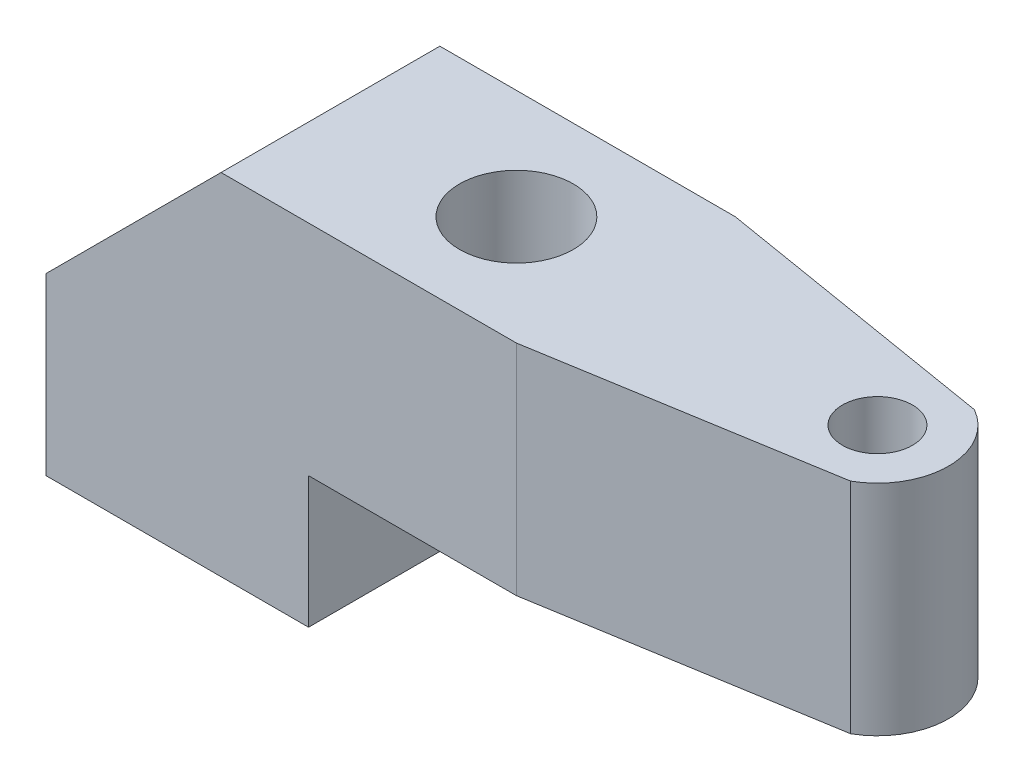
ISO-10303-21;
HEADER;
FILE_DESCRIPTION(('STEP AP214'),'2;1');
FILE_NAME('part.step','',(''),(''),'','','');
FILE_SCHEMA(('AUTOMOTIVE_DESIGN { 1 0 10303 214 1 1 1 1 }'));
ENDSEC;
DATA;
#1=APPLICATION_CONTEXT('core data for automotive mechanical design processes');
#2=APPLICATION_PROTOCOL_DEFINITION('international standard','automotive_design',2000,#1);
#3=PRODUCT_CONTEXT('',#1,'mechanical');
#4=PRODUCT('Part','Part','',(#3));
#5=PRODUCT_RELATED_PRODUCT_CATEGORY('part','',(#4));
#6=PRODUCT_DEFINITION_FORMATION('','',#4);
#7=PRODUCT_DEFINITION_CONTEXT('part definition',#1,'design');
#8=PRODUCT_DEFINITION('design','',#6,#7);
#9=PRODUCT_DEFINITION_SHAPE('','',#8);
#10=(LENGTH_UNIT() NAMED_UNIT(*) SI_UNIT(.MILLI.,.METRE.));
#11=(NAMED_UNIT(*) PLANE_ANGLE_UNIT() SI_UNIT($,.RADIAN.));
#12=(NAMED_UNIT(*) SI_UNIT($,.STERADIAN.) SOLID_ANGLE_UNIT());
#13=UNCERTAINTY_MEASURE_WITH_UNIT(LENGTH_MEASURE(1.E-05),#10,'distance_accuracy_value','');
#14=(GEOMETRIC_REPRESENTATION_CONTEXT(3) GLOBAL_UNCERTAINTY_ASSIGNED_CONTEXT((#13)) GLOBAL_UNIT_ASSIGNED_CONTEXT((#10,
#11,#12)) REPRESENTATION_CONTEXT('',''));
#15=CARTESIAN_POINT('',(0.,0.,0.));
#16=DIRECTION('',(0.,0.,1.));
#17=DIRECTION('',(1.,0.,0.));
#18=AXIS2_PLACEMENT_3D('',#15,#16,#17);
#19=CARTESIAN_POINT('',(231.,16.,-37.25));
#20=DIRECTION('',(0.,-1.,0.));
#21=DIRECTION('',(0.,0.,-1.));
#22=AXIS2_PLACEMENT_3D('',#19,#20,#21);
#23=PLANE('',#22);
#24=DIRECTION('',(-1.,0.,0.));
#25=VECTOR('',#24,1.);
#26=CARTESIAN_POINT('',(219.5,16.,-42.25));
#27=LINE('',#26,#25);
#28=CARTESIAN_POINT('',(219.5,16.,-42.25));
#29=VERTEX_POINT('',#28);
#30=CARTESIAN_POINT('',(206.,16.,-42.25));
#31=VERTEX_POINT('',#30);
#32=EDGE_CURVE('E157',#29,#31,#27,.T.);
#33=ORIENTED_EDGE('',*,*,#32,.T.);
#34=DIRECTION('',(0.,0.,1.));
#35=VECTOR('',#34,1.);
#36=CARTESIAN_POINT('',(206.,16.,-37.25));
#37=LINE('',#36,#35);
#38=CARTESIAN_POINT('',(206.,16.,-32.25));
#39=VERTEX_POINT('',#38);
#40=EDGE_CURVE('E189',#31,#39,#37,.T.);
#41=ORIENTED_EDGE('',*,*,#40,.T.);
#42=DIRECTION('',(1.,0.,0.));
#43=VECTOR('',#42,1.);
#44=CARTESIAN_POINT('',(219.5,16.,-32.25));
#45=LINE('',#44,#43);
#46=CARTESIAN_POINT('',(219.5,16.,-32.25));
#47=VERTEX_POINT('',#46);
#48=EDGE_CURVE('E160',#39,#47,#45,.T.);
#49=ORIENTED_EDGE('',*,*,#48,.T.);
#50=DIRECTION('',(0.986542536377933,0.,-0.163504813130974));
#51=VECTOR('',#50,1.);
#52=CARTESIAN_POINT('',(232.6,16.,-34.4211309680369));
#53=LINE('',#52,#51);
#54=CARTESIAN_POINT('',(232.6,16.,-34.4211309680369));
#55=VERTEX_POINT('',#54);
#56=EDGE_CURVE('E163',#47,#55,#53,.T.);
#57=ORIENTED_EDGE('',*,*,#56,.T.);
#58=CARTESIAN_POINT('',(231.,16.,-37.25));
#59=DIRECTION('',(0.,1.,0.));
#60=DIRECTION('',(0.,0.,-1.));
#61=AXIS2_PLACEMENT_3D('',#58,#59,#60);
#62=CIRCLE('',#61,3.24999999999998);
#63=CARTESIAN_POINT('',(232.6,16.,-40.0788690319631));
#64=VERTEX_POINT('',#63);
#65=EDGE_CURVE('E165',#55,#64,#62,.T.);
#66=ORIENTED_EDGE('',*,*,#65,.T.);
#67=DIRECTION('',(-0.986542536377933,0.,-0.163504813130976));
#68=VECTOR('',#67,1.);
#69=CARTESIAN_POINT('',(232.6,16.,-40.0788690319631));
#70=LINE('',#69,#68);
#71=EDGE_CURVE('E167',#64,#29,#70,.T.);
#72=ORIENTED_EDGE('',*,*,#71,.T.);
#73=EDGE_LOOP('',(#33,#41,#49,#57,#66,#72));
#74=FACE_BOUND('',#73,.T.);
#75=CARTESIAN_POINT('',(231.,16.,-37.25));
#76=DIRECTION('',(0.,1.,0.));
#77=DIRECTION('',(0.,0.,1.));
#78=AXIS2_PLACEMENT_3D('',#75,#76,#77);
#79=CIRCLE('',#78,1.59999999999999);
#80=CARTESIAN_POINT('',(231.,16.,-35.65));
#81=VERTEX_POINT('',#80);
#82=EDGE_CURVE('E152',#81,#81,#79,.T.);
#83=ORIENTED_EDGE('',*,*,#82,.F.);
#84=EDGE_LOOP('',(#83));
#85=FACE_BOUND('',#84,.T.);
#86=CARTESIAN_POINT('',(214.5,16.,-37.25));
#87=DIRECTION('',(0.,1.,0.));
#88=DIRECTION('',(0.,0.,1.));
#89=AXIS2_PLACEMENT_3D('',#86,#87,#88);
#90=CIRCLE('',#89,2.59999999999999);
#91=CARTESIAN_POINT('',(214.5,16.,-34.65));
#92=VERTEX_POINT('',#91);
#93=EDGE_CURVE('E145',#92,#92,#90,.T.);
#94=ORIENTED_EDGE('',*,*,#93,.F.);
#95=EDGE_LOOP('',(#94));
#96=FACE_BOUND('',#95,.T.);
#97=ADVANCED_FACE('F42',(#74,#85,#96),#23,.F.);
#98=CARTESIAN_POINT('',(231.,6.00000000000001,-37.25));
#99=DIRECTION('',(0.,-1.,0.));
#100=DIRECTION('',(0.,0.,-1.));
#101=AXIS2_PLACEMENT_3D('',#98,#99,#100);
#102=PLANE('',#101);
#103=DIRECTION('',(0.,0.,1.));
#104=VECTOR('',#103,1.);
#105=CARTESIAN_POINT('',(210.,6.00000000000001,-42.25));
#106=LINE('',#105,#104);
#107=CARTESIAN_POINT('',(210.,6.00000000000001,-42.25));
#108=VERTEX_POINT('',#107);
#109=CARTESIAN_POINT('',(210.,6.00000000000001,-32.25));
#110=VERTEX_POINT('',#109);
#111=EDGE_CURVE('E116',#108,#110,#106,.T.);
#112=ORIENTED_EDGE('',*,*,#111,.F.);
#113=DIRECTION('',(-1.,0.,0.));
#114=VECTOR('',#113,1.);
#115=CARTESIAN_POINT('',(219.5,6.00000000000001,-42.25));
#116=LINE('',#115,#114);
#117=CARTESIAN_POINT('',(219.5,6.00000000000001,-42.25));
#118=VERTEX_POINT('',#117);
#119=EDGE_CURVE('E122',#118,#108,#116,.T.);
#120=ORIENTED_EDGE('',*,*,#119,.F.);
#121=DIRECTION('',(-0.986542536377933,0.,-0.163504813130976));
#122=VECTOR('',#121,1.);
#123=CARTESIAN_POINT('',(232.6,6.00000000000001,-40.0788690319631));
#124=LINE('',#123,#122);
#125=CARTESIAN_POINT('',(232.6,6.00000000000001,-40.0788690319631));
#126=VERTEX_POINT('',#125);
#127=EDGE_CURVE('E161',#126,#118,#124,.T.);
#128=ORIENTED_EDGE('',*,*,#127,.F.);
#129=CARTESIAN_POINT('',(231.,6.00000000000001,-37.25));
#130=DIRECTION('',(0.,1.,0.));
#131=DIRECTION('',(0.,0.,-1.));
#132=AXIS2_PLACEMENT_3D('',#129,#130,#131);
#133=CIRCLE('',#132,3.24999999999998);
#134=CARTESIAN_POINT('',(232.6,6.00000000000001,-34.4211309680369));
#135=VERTEX_POINT('',#134);
#136=EDGE_CURVE('E172',#135,#126,#133,.T.);
#137=ORIENTED_EDGE('',*,*,#136,.F.);
#138=DIRECTION('',(0.986542536377933,0.,-0.163504813130974));
#139=VECTOR('',#138,1.);
#140=CARTESIAN_POINT('',(232.6,6.00000000000001,-34.4211309680369));
#141=LINE('',#140,#139);
#142=CARTESIAN_POINT('',(219.5,6.00000000000001,-32.25));
#143=VERTEX_POINT('',#142);
#144=EDGE_CURVE('E119',#143,#135,#141,.T.);
#145=ORIENTED_EDGE('',*,*,#144,.F.);
#146=DIRECTION('',(1.,0.,0.));
#147=VECTOR('',#146,1.);
#148=CARTESIAN_POINT('',(219.5,6.00000000000001,-32.25));
#149=LINE('',#148,#147);
#150=EDGE_CURVE('E110',#110,#143,#149,.T.);
#151=ORIENTED_EDGE('',*,*,#150,.F.);
#152=EDGE_LOOP('',(#112,#120,#128,#137,#145,#151));
#153=FACE_BOUND('',#152,.T.);
#154=CARTESIAN_POINT('',(231.,6.00000000000001,-37.25));
#155=DIRECTION('',(0.,1.,0.));
#156=DIRECTION('',(0.,0.,1.));
#157=AXIS2_PLACEMENT_3D('',#154,#155,#156);
#158=CIRCLE('',#157,1.59999999999999);
#159=CARTESIAN_POINT('',(231.,6.00000000000001,-35.65));
#160=VERTEX_POINT('',#159);
#161=EDGE_CURVE('E148',#160,#160,#158,.T.);
#162=ORIENTED_EDGE('',*,*,#161,.T.);
#163=EDGE_LOOP('',(#162));
#164=FACE_BOUND('',#163,.T.);
#165=CARTESIAN_POINT('',(214.5,6.00000000000001,-37.25));
#166=DIRECTION('',(0.,1.,0.));
#167=DIRECTION('',(0.,0.,1.));
#168=AXIS2_PLACEMENT_3D('',#165,#166,#167);
#169=CIRCLE('',#168,2.59999999999999);
#170=CARTESIAN_POINT('',(214.5,6.00000000000001,-34.65));
#171=VERTEX_POINT('',#170);
#172=EDGE_CURVE('E149',#171,#171,#169,.T.);
#173=ORIENTED_EDGE('',*,*,#172,.T.);
#174=EDGE_LOOP('',(#173));
#175=FACE_BOUND('',#174,.T.);
#176=ADVANCED_FACE('F112',(#153,#164,#175),#102,.T.);
#177=CARTESIAN_POINT('',(219.5,16.,-42.25));
#178=DIRECTION('',(0.,0.,1.));
#179=DIRECTION('',(1.,0.,0.));
#180=AXIS2_PLACEMENT_3D('',#177,#178,#179);
#181=PLANE('',#180);
#182=DIRECTION('',(0.,-1.,0.));
#183=VECTOR('',#182,1.);
#184=CARTESIAN_POINT('',(198.,16.,-42.25));
#185=LINE('',#184,#183);
#186=CARTESIAN_POINT('',(198.,7.99999999999998,-42.25));
#187=VERTEX_POINT('',#186);
#188=CARTESIAN_POINT('',(198.,0.,-42.25));
#189=VERTEX_POINT('',#188);
#190=EDGE_CURVE('E187',#187,#189,#185,.T.);
#191=ORIENTED_EDGE('',*,*,#190,.F.);
#192=DIRECTION('',(-0.707106781186546,-0.707106781186549,0.));
#193=VECTOR('',#192,1.);
#194=CARTESIAN_POINT('',(206.,16.,-42.25));
#195=LINE('',#194,#193);
#196=EDGE_CURVE('E12',#187,#31,#195,.F.);
#197=ORIENTED_EDGE('',*,*,#196,.T.);
#198=ORIENTED_EDGE('',*,*,#32,.F.);
#199=DIRECTION('',(0.,-1.,0.));
#200=VECTOR('',#199,1.);
#201=CARTESIAN_POINT('',(219.5,16.,-42.25));
#202=LINE('',#201,#200);
#203=EDGE_CURVE('E169',#29,#118,#202,.T.);
#204=ORIENTED_EDGE('',*,*,#203,.T.);
#205=ORIENTED_EDGE('',*,*,#119,.T.);
#206=DIRECTION('',(0.,1.,0.));
#207=VECTOR('',#206,1.);
#208=CARTESIAN_POINT('',(210.,-15.6204993518133,-42.25));
#209=LINE('',#208,#207);
#210=CARTESIAN_POINT('',(210.,0.,-42.25));
#211=VERTEX_POINT('',#210);
#212=EDGE_CURVE('E132',#211,#108,#209,.T.);
#213=ORIENTED_EDGE('',*,*,#212,.F.);
#214=DIRECTION('',(-1.,0.,0.));
#215=VECTOR('',#214,1.);
#216=CARTESIAN_POINT('',(198.,0.,-42.25));
#217=LINE('',#216,#215);
#218=EDGE_CURVE('E316',#211,#189,#217,.T.);
#219=ORIENTED_EDGE('',*,*,#218,.T.);
#220=EDGE_LOOP('',(#191,#197,#198,#204,#205,#213,#219));
#221=FACE_BOUND('',#220,.T.);
#222=ADVANCED_FACE('F212',(#221),#181,.F.);
#223=CARTESIAN_POINT('',(198.,16.,-32.25));
#224=DIRECTION('',(1.,0.,0.));
#225=DIRECTION('',(0.,0.,-1.));
#226=AXIS2_PLACEMENT_3D('',#223,#224,#225);
#227=PLANE('',#226);
#228=DIRECTION('',(0.,-1.,0.));
#229=VECTOR('',#228,1.);
#230=CARTESIAN_POINT('',(198.,16.,-32.25));
#231=LINE('',#230,#229);
#232=CARTESIAN_POINT('',(198.,7.99999999999998,-32.25));
#233=VERTEX_POINT('',#232);
#234=CARTESIAN_POINT('',(198.,0.,-32.25));
#235=VERTEX_POINT('',#234);
#236=EDGE_CURVE('E185',#233,#235,#231,.T.);
#237=ORIENTED_EDGE('',*,*,#236,.F.);
#238=DIRECTION('',(0.,0.,-1.));
#239=VECTOR('',#238,1.);
#240=CARTESIAN_POINT('',(198.,7.99999999999998,-32.25));
#241=LINE('',#240,#239);
#242=EDGE_CURVE('E50',#233,#187,#241,.T.);
#243=ORIENTED_EDGE('',*,*,#242,.T.);
#244=ORIENTED_EDGE('',*,*,#190,.T.);
#245=DIRECTION('',(0.,0.,1.));
#246=VECTOR('',#245,1.);
#247=CARTESIAN_POINT('',(198.,0.,-42.25));
#248=LINE('',#247,#246);
#249=EDGE_CURVE('E139',#189,#235,#248,.T.);
#250=ORIENTED_EDGE('',*,*,#249,.T.);
#251=EDGE_LOOP('',(#237,#243,#244,#250));
#252=FACE_BOUND('',#251,.T.);
#253=ADVANCED_FACE('F239',(#252),#227,.F.);
#254=CARTESIAN_POINT('',(219.5,16.,-32.25));
#255=DIRECTION('',(0.,0.,-1.));
#256=DIRECTION('',(-1.,0.,0.));
#257=AXIS2_PLACEMENT_3D('',#254,#255,#256);
#258=PLANE('',#257);
#259=ORIENTED_EDGE('',*,*,#48,.F.);
#260=DIRECTION('',(0.707106781186546,0.707106781186549,0.));
#261=VECTOR('',#260,1.);
#262=CARTESIAN_POINT('',(206.,16.,-32.25));
#263=LINE('',#262,#261);
#264=EDGE_CURVE('E64',#39,#233,#263,.F.);
#265=ORIENTED_EDGE('',*,*,#264,.T.);
#266=ORIENTED_EDGE('',*,*,#236,.T.);
#267=DIRECTION('',(1.,0.,0.));
#268=VECTOR('',#267,1.);
#269=CARTESIAN_POINT('',(198.,0.,-32.25));
#270=LINE('',#269,#268);
#271=CARTESIAN_POINT('',(210.,0.,-32.25));
#272=VERTEX_POINT('',#271);
#273=EDGE_CURVE('E129',#235,#272,#270,.T.);
#274=ORIENTED_EDGE('',*,*,#273,.T.);
#275=DIRECTION('',(0.,1.,0.));
#276=VECTOR('',#275,1.);
#277=CARTESIAN_POINT('',(210.,-15.6204993518133,-32.25));
#278=LINE('',#277,#276);
#279=EDGE_CURVE('E126',#272,#110,#278,.T.);
#280=ORIENTED_EDGE('',*,*,#279,.T.);
#281=ORIENTED_EDGE('',*,*,#150,.T.);
#282=DIRECTION('',(0.,-1.,0.));
#283=VECTOR('',#282,1.);
#284=CARTESIAN_POINT('',(219.5,16.,-32.25));
#285=LINE('',#284,#283);
#286=EDGE_CURVE('E183',#47,#143,#285,.T.);
#287=ORIENTED_EDGE('',*,*,#286,.F.);
#288=EDGE_LOOP('',(#259,#265,#266,#274,#280,#281,#287));
#289=FACE_BOUND('',#288,.T.);
#290=ADVANCED_FACE('F127',(#289),#258,.F.);
#291=CARTESIAN_POINT('',(232.6,16.,-34.4211309680369));
#292=DIRECTION('',(-0.163504813130974,0.,-0.986542536377933));
#293=DIRECTION('',(-0.986542536377933,0.,0.163504813130974));
#294=AXIS2_PLACEMENT_3D('',#291,#292,#293);
#295=PLANE('',#294);
#296=ORIENTED_EDGE('',*,*,#144,.T.);
#297=DIRECTION('',(0.,-1.,0.));
#298=VECTOR('',#297,1.);
#299=CARTESIAN_POINT('',(232.6,16.,-34.4211309680369));
#300=LINE('',#299,#298);
#301=EDGE_CURVE('E180',#55,#135,#300,.T.);
#302=ORIENTED_EDGE('',*,*,#301,.F.);
#303=ORIENTED_EDGE('',*,*,#56,.F.);
#304=ORIENTED_EDGE('',*,*,#286,.T.);
#305=EDGE_LOOP('',(#296,#302,#303,#304));
#306=FACE_BOUND('',#305,.T.);
#307=ADVANCED_FACE('F201',(#306),#295,.F.);
#308=CARTESIAN_POINT('',(231.,16.,-37.25));
#309=DIRECTION('',(0.,-1.,0.));
#310=DIRECTION('',(0.,0.,-1.));
#311=AXIS2_PLACEMENT_3D('',#308,#309,#310);
#312=CYLINDRICAL_SURFACE('',#311,3.24999999999998);
#313=ORIENTED_EDGE('',*,*,#136,.T.);
#314=DIRECTION('',(0.,-1.,0.));
#315=VECTOR('',#314,1.);
#316=CARTESIAN_POINT('',(232.6,16.,-40.0788690319631));
#317=LINE('',#316,#315);
#318=EDGE_CURVE('E177',#64,#126,#317,.T.);
#319=ORIENTED_EDGE('',*,*,#318,.F.);
#320=ORIENTED_EDGE('',*,*,#65,.F.);
#321=ORIENTED_EDGE('',*,*,#301,.T.);
#322=EDGE_LOOP('',(#313,#319,#320,#321));
#323=FACE_BOUND('',#322,.T.);
#324=ADVANCED_FACE('F207',(#323),#312,.T.);
#325=CARTESIAN_POINT('',(232.6,16.,-40.0788690319631));
#326=DIRECTION('',(-0.163504813130976,0.,0.986542536377933));
#327=DIRECTION('',(0.986542536377933,0.,0.163504813130976));
#328=AXIS2_PLACEMENT_3D('',#325,#326,#327);
#329=PLANE('',#328);
#330=ORIENTED_EDGE('',*,*,#127,.T.);
#331=ORIENTED_EDGE('',*,*,#203,.F.);
#332=ORIENTED_EDGE('',*,*,#71,.F.);
#333=ORIENTED_EDGE('',*,*,#318,.T.);
#334=EDGE_LOOP('',(#330,#331,#332,#333));
#335=FACE_BOUND('',#334,.T.);
#336=ADVANCED_FACE('F210',(#335),#329,.F.);
#337=CARTESIAN_POINT('',(231.,16.,-37.25));
#338=DIRECTION('',(0.,-1.,0.));
#339=DIRECTION('',(0.,0.,-1.));
#340=AXIS2_PLACEMENT_3D('',#337,#338,#339);
#341=CYLINDRICAL_SURFACE('',#340,1.59999999999999);
#342=ORIENTED_EDGE('',*,*,#82,.T.);
#343=EDGE_LOOP('',(#342));
#344=FACE_BOUND('',#343,.T.);
#345=ORIENTED_EDGE('',*,*,#161,.F.);
#346=EDGE_LOOP('',(#345));
#347=FACE_BOUND('',#346,.T.);
#348=ADVANCED_FACE('F228',(#344,#347),#341,.F.);
#349=CARTESIAN_POINT('',(214.5,16.,-37.25));
#350=DIRECTION('',(0.,-1.,0.));
#351=DIRECTION('',(0.,0.,-1.));
#352=AXIS2_PLACEMENT_3D('',#349,#350,#351);
#353=CYLINDRICAL_SURFACE('',#352,2.59999999999999);
#354=ORIENTED_EDGE('',*,*,#93,.T.);
#355=EDGE_LOOP('',(#354));
#356=FACE_BOUND('',#355,.T.);
#357=ORIENTED_EDGE('',*,*,#172,.F.);
#358=EDGE_LOOP('',(#357));
#359=FACE_BOUND('',#358,.T.);
#360=ADVANCED_FACE('F277',(#356,#359),#353,.F.);
#361=CARTESIAN_POINT('',(210.,-15.6204993518133,-42.25));
#362=DIRECTION('',(-1.,0.,0.));
#363=DIRECTION('',(0.,0.,1.));
#364=AXIS2_PLACEMENT_3D('',#361,#362,#363);
#365=PLANE('',#364);
#366=ORIENTED_EDGE('',*,*,#279,.F.);
#367=DIRECTION('',(0.,0.,-1.));
#368=VECTOR('',#367,1.);
#369=CARTESIAN_POINT('',(210.,0.,-42.25));
#370=LINE('',#369,#368);
#371=EDGE_CURVE('E144',#272,#211,#370,.T.);
#372=ORIENTED_EDGE('',*,*,#371,.T.);
#373=ORIENTED_EDGE('',*,*,#212,.T.);
#374=ORIENTED_EDGE('',*,*,#111,.T.);
#375=EDGE_LOOP('',(#366,#372,#373,#374));
#376=FACE_BOUND('',#375,.T.);
#377=ADVANCED_FACE('F135',(#376),#365,.F.);
#378=CARTESIAN_POINT('',(0.,0.,0.));
#379=DIRECTION('',(0.,1.,0.));
#380=DIRECTION('',(0.,0.,1.));
#381=AXIS2_PLACEMENT_3D('',#378,#379,#380);
#382=PLANE('',#381);
#383=ORIENTED_EDGE('',*,*,#218,.F.);
#384=ORIENTED_EDGE('',*,*,#371,.F.);
#385=ORIENTED_EDGE('',*,*,#273,.F.);
#386=ORIENTED_EDGE('',*,*,#249,.F.);
#387=EDGE_LOOP('',(#383,#384,#385,#386));
#388=FACE_BOUND('',#387,.T.);
#389=ADVANCED_FACE('F215',(#388),#382,.F.);
#390=CARTESIAN_POINT('',(206.,16.,-37.25));
#391=DIRECTION('',(0.707106781186549,-0.707106781186546,0.));
#392=DIRECTION('',(0.,0.,1.));
#393=AXIS2_PLACEMENT_3D('',#390,#391,#392);
#394=PLANE('',#393);
#395=ORIENTED_EDGE('',*,*,#196,.F.);
#396=ORIENTED_EDGE('',*,*,#242,.F.);
#397=ORIENTED_EDGE('',*,*,#264,.F.);
#398=ORIENTED_EDGE('',*,*,#40,.F.);
#399=EDGE_LOOP('',(#395,#396,#397,#398));
#400=FACE_BOUND('',#399,.T.);
#401=ADVANCED_FACE('F44',(#400),#394,.F.);
#402=CLOSED_SHELL('',(#97,#176,#222,#253,#290,#307,#324,#336,#348,#360,#377,#389,#401));
#403=MANIFOLD_SOLID_BREP('B2',#402);
#404=ADVANCED_BREP_SHAPE_REPRESENTATION('',(#18,#403),#14);
#405=SHAPE_DEFINITION_REPRESENTATION(#9,#404);
ENDSEC;
END-ISO-10303-21;
